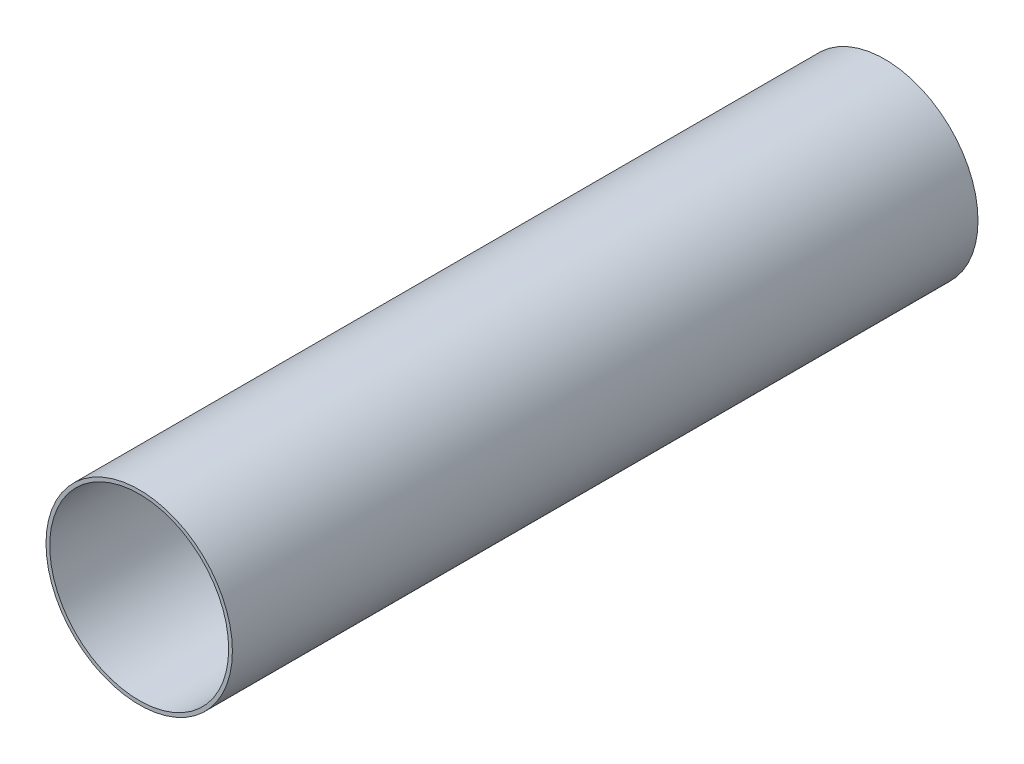
ISO-10303-21;
HEADER;
FILE_DESCRIPTION(('STEP AP214'),'2;1');
FILE_NAME('part.step','',(''),(''),'','','');
FILE_SCHEMA(('AUTOMOTIVE_DESIGN { 1 0 10303 214 1 1 1 1 }'));
ENDSEC;
DATA;
#1=APPLICATION_CONTEXT('core data for automotive mechanical design processes');
#2=APPLICATION_PROTOCOL_DEFINITION('international standard','automotive_design',2000,#1);
#3=PRODUCT_CONTEXT('',#1,'mechanical');
#4=PRODUCT('Part','Part','',(#3));
#5=PRODUCT_RELATED_PRODUCT_CATEGORY('part','',(#4));
#6=PRODUCT_DEFINITION_FORMATION('','',#4);
#7=PRODUCT_DEFINITION_CONTEXT('part definition',#1,'design');
#8=PRODUCT_DEFINITION('design','',#6,#7);
#9=PRODUCT_DEFINITION_SHAPE('','',#8);
#10=(LENGTH_UNIT() NAMED_UNIT(*) SI_UNIT(.MILLI.,.METRE.));
#11=(NAMED_UNIT(*) PLANE_ANGLE_UNIT() SI_UNIT($,.RADIAN.));
#12=(NAMED_UNIT(*) SI_UNIT($,.STERADIAN.) SOLID_ANGLE_UNIT());
#13=UNCERTAINTY_MEASURE_WITH_UNIT(LENGTH_MEASURE(1.E-05),#10,'distance_accuracy_value','');
#14=(GEOMETRIC_REPRESENTATION_CONTEXT(3) GLOBAL_UNCERTAINTY_ASSIGNED_CONTEXT((#13)) GLOBAL_UNIT_ASSIGNED_CONTEXT((#10,
#11,#12)) REPRESENTATION_CONTEXT('',''));
#15=CARTESIAN_POINT('',(0.,0.,0.));
#16=DIRECTION('',(0.,0.,1.));
#17=DIRECTION('',(1.,0.,0.));
#18=AXIS2_PLACEMENT_3D('',#15,#16,#17);
#19=CARTESIAN_POINT('',(0.,0.,200.));
#20=DIRECTION('',(0.,0.,1.));
#21=DIRECTION('',(1.,0.,0.));
#22=AXIS2_PLACEMENT_3D('',#19,#20,#21);
#23=PLANE('',#22);
#24=CARTESIAN_POINT('',(0.,0.,200.));
#25=DIRECTION('',(0.,0.,1.));
#26=DIRECTION('',(1.,0.,0.));
#27=AXIS2_PLACEMENT_3D('',#24,#25,#26);
#28=CIRCLE('',#27,25.);
#29=CARTESIAN_POINT('',(25.,0.,200.));
#30=VERTEX_POINT('',#29);
#31=EDGE_CURVE('E11',#30,#30,#28,.T.);
#32=ORIENTED_EDGE('',*,*,#31,.T.);
#33=EDGE_LOOP('',(#32));
#34=FACE_BOUND('',#33,.T.);
#35=CARTESIAN_POINT('',(0.,0.,200.));
#36=DIRECTION('',(0.,0.,1.));
#37=DIRECTION('',(1.,0.,0.));
#38=AXIS2_PLACEMENT_3D('',#35,#36,#37);
#39=CIRCLE('',#38,24.);
#40=CARTESIAN_POINT('',(24.,0.,200.));
#41=VERTEX_POINT('',#40);
#42=EDGE_CURVE('E50',#41,#41,#39,.T.);
#43=ORIENTED_EDGE('',*,*,#42,.F.);
#44=EDGE_LOOP('',(#43));
#45=FACE_BOUND('',#44,.T.);
#46=ADVANCED_FACE('F39',(#34,#45),#23,.T.);
#47=CARTESIAN_POINT('',(0.,0.,0.));
#48=DIRECTION('',(0.,0.,1.));
#49=DIRECTION('',(1.,0.,0.));
#50=AXIS2_PLACEMENT_3D('',#47,#48,#49);
#51=PLANE('',#50);
#52=CARTESIAN_POINT('',(0.,0.,0.));
#53=DIRECTION('',(0.,0.,1.));
#54=DIRECTION('',(1.,0.,0.));
#55=AXIS2_PLACEMENT_3D('',#52,#53,#54);
#56=CIRCLE('',#55,25.);
#57=CARTESIAN_POINT('',(25.,0.,0.));
#58=VERTEX_POINT('',#57);
#59=EDGE_CURVE('E43',#58,#58,#56,.T.);
#60=ORIENTED_EDGE('',*,*,#59,.F.);
#61=EDGE_LOOP('',(#60));
#62=FACE_BOUND('',#61,.T.);
#63=CARTESIAN_POINT('',(0.,0.,0.));
#64=DIRECTION('',(0.,0.,1.));
#65=DIRECTION('',(1.,0.,0.));
#66=AXIS2_PLACEMENT_3D('',#63,#64,#65);
#67=CIRCLE('',#66,24.);
#68=CARTESIAN_POINT('',(24.,0.,0.));
#69=VERTEX_POINT('',#68);
#70=EDGE_CURVE('E52',#69,#69,#67,.T.);
#71=ORIENTED_EDGE('',*,*,#70,.T.);
#72=EDGE_LOOP('',(#71));
#73=FACE_BOUND('',#72,.T.);
#74=ADVANCED_FACE('F62',(#62,#73),#51,.F.);
#75=CARTESIAN_POINT('',(0.,0.,200.));
#76=DIRECTION('',(0.,0.,-1.));
#77=DIRECTION('',(-1.,0.,0.));
#78=AXIS2_PLACEMENT_3D('',#75,#76,#77);
#79=CYLINDRICAL_SURFACE('',#78,25.);
#80=ORIENTED_EDGE('',*,*,#31,.F.);
#81=EDGE_LOOP('',(#80));
#82=FACE_BOUND('',#81,.T.);
#83=ORIENTED_EDGE('',*,*,#59,.T.);
#84=EDGE_LOOP('',(#83));
#85=FACE_BOUND('',#84,.T.);
#86=ADVANCED_FACE('F41',(#82,#85),#79,.T.);
#87=CARTESIAN_POINT('',(0.,0.,200.));
#88=DIRECTION('',(0.,0.,-1.));
#89=DIRECTION('',(-1.,0.,0.));
#90=AXIS2_PLACEMENT_3D('',#87,#88,#89);
#91=CYLINDRICAL_SURFACE('',#90,24.);
#92=ORIENTED_EDGE('',*,*,#42,.T.);
#93=EDGE_LOOP('',(#92));
#94=FACE_BOUND('',#93,.T.);
#95=ORIENTED_EDGE('',*,*,#70,.F.);
#96=EDGE_LOOP('',(#95));
#97=FACE_BOUND('',#96,.T.);
#98=ADVANCED_FACE('F58',(#94,#97),#91,.F.);
#99=CLOSED_SHELL('',(#46,#74,#86,#98));
#100=MANIFOLD_SOLID_BREP('B2',#99);
#101=ADVANCED_BREP_SHAPE_REPRESENTATION('',(#18,#100),#14);
#102=SHAPE_DEFINITION_REPRESENTATION(#9,#101);
ENDSEC;
END-ISO-10303-21;
